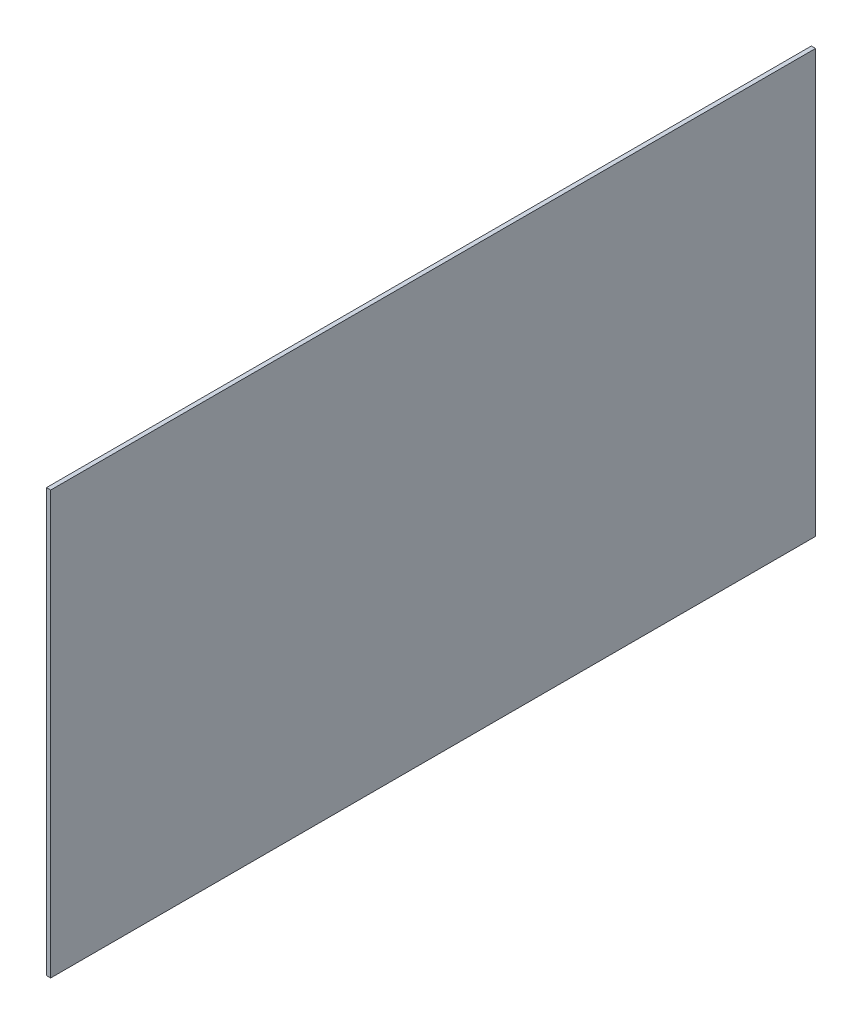
ISO-10303-21;
HEADER;
FILE_DESCRIPTION(('STEP AP214'),'2;1');
FILE_NAME('part.step','',(''),(''),'','','');
FILE_SCHEMA(('AUTOMOTIVE_DESIGN { 1 0 10303 214 1 1 1 1 }'));
ENDSEC;
DATA;
#1=APPLICATION_CONTEXT('core data for automotive mechanical design processes');
#2=APPLICATION_PROTOCOL_DEFINITION('international standard','automotive_design',2000,#1);
#3=PRODUCT_CONTEXT('',#1,'mechanical');
#4=PRODUCT('Part','Part','',(#3));
#5=PRODUCT_RELATED_PRODUCT_CATEGORY('part','',(#4));
#6=PRODUCT_DEFINITION_FORMATION('','',#4);
#7=PRODUCT_DEFINITION_CONTEXT('part definition',#1,'design');
#8=PRODUCT_DEFINITION('design','',#6,#7);
#9=PRODUCT_DEFINITION_SHAPE('','',#8);
#10=(LENGTH_UNIT() NAMED_UNIT(*) SI_UNIT(.MILLI.,.METRE.));
#11=(NAMED_UNIT(*) PLANE_ANGLE_UNIT() SI_UNIT($,.RADIAN.));
#12=(NAMED_UNIT(*) SI_UNIT($,.STERADIAN.) SOLID_ANGLE_UNIT());
#13=UNCERTAINTY_MEASURE_WITH_UNIT(LENGTH_MEASURE(1.E-05),#10,'distance_accuracy_value','');
#14=(GEOMETRIC_REPRESENTATION_CONTEXT(3) GLOBAL_UNCERTAINTY_ASSIGNED_CONTEXT((#13)) GLOBAL_UNIT_ASSIGNED_CONTEXT((#10,
#11,#12)) REPRESENTATION_CONTEXT('',''));
#15=CARTESIAN_POINT('',(0.,0.,0.));
#16=DIRECTION('',(0.,0.,1.));
#17=DIRECTION('',(1.,0.,0.));
#18=AXIS2_PLACEMENT_3D('',#15,#16,#17);
#19=CARTESIAN_POINT('',(1.49999999999997,300.,-271.5));
#20=DIRECTION('',(-1.,0.,0.));
#21=DIRECTION('',(0.,0.,1.));
#22=AXIS2_PLACEMENT_3D('',#19,#20,#21);
#23=PLANE('',#22);
#24=DIRECTION('',(0.,0.,-1.));
#25=VECTOR('',#24,1.);
#26=CARTESIAN_POINT('',(1.49999999999997,0.,-271.5));
#27=LINE('',#26,#25);
#28=CARTESIAN_POINT('',(1.50000000000003,0.,271.5));
#29=VERTEX_POINT('',#28);
#30=CARTESIAN_POINT('',(1.49999999999997,0.,-271.5));
#31=VERTEX_POINT('',#30);
#32=EDGE_CURVE('E115',#29,#31,#27,.T.);
#33=ORIENTED_EDGE('',*,*,#32,.T.);
#34=DIRECTION('',(0.,-1.,0.));
#35=VECTOR('',#34,1.);
#36=CARTESIAN_POINT('',(1.49999999999997,300.,-271.5));
#37=LINE('',#36,#35);
#38=CARTESIAN_POINT('',(1.49999999999997,300.,-271.5));
#39=VERTEX_POINT('',#38);
#40=EDGE_CURVE('E11',#39,#31,#37,.T.);
#41=ORIENTED_EDGE('',*,*,#40,.F.);
#42=DIRECTION('',(0.,0.,-1.));
#43=VECTOR('',#42,1.);
#44=CARTESIAN_POINT('',(1.49999999999997,300.,-271.5));
#45=LINE('',#44,#43);
#46=CARTESIAN_POINT('',(1.50000000000003,300.,271.5));
#47=VERTEX_POINT('',#46);
#48=EDGE_CURVE('E99',#47,#39,#45,.T.);
#49=ORIENTED_EDGE('',*,*,#48,.F.);
#50=DIRECTION('',(0.,-1.,0.));
#51=VECTOR('',#50,1.);
#52=CARTESIAN_POINT('',(1.50000000000003,300.,271.5));
#53=LINE('',#52,#51);
#54=EDGE_CURVE('E111',#47,#29,#53,.T.);
#55=ORIENTED_EDGE('',*,*,#54,.T.);
#56=EDGE_LOOP('',(#33,#41,#49,#55));
#57=FACE_BOUND('',#56,.T.);
#58=ADVANCED_FACE('F47',(#57),#23,.F.);
#59=CARTESIAN_POINT('',(-1.50000000000003,300.,-271.5));
#60=DIRECTION('',(0.,0.,1.));
#61=DIRECTION('',(1.,0.,0.));
#62=AXIS2_PLACEMENT_3D('',#59,#60,#61);
#63=PLANE('',#62);
#64=DIRECTION('',(-1.,0.,0.));
#65=VECTOR('',#64,1.);
#66=CARTESIAN_POINT('',(-1.50000000000003,0.,-271.5));
#67=LINE('',#66,#65);
#68=CARTESIAN_POINT('',(-1.50000000000003,0.,-271.5));
#69=VERTEX_POINT('',#68);
#70=EDGE_CURVE('E104',#31,#69,#67,.T.);
#71=ORIENTED_EDGE('',*,*,#70,.T.);
#72=DIRECTION('',(0.,-1.,0.));
#73=VECTOR('',#72,1.);
#74=CARTESIAN_POINT('',(-1.50000000000003,300.,-271.5));
#75=LINE('',#74,#73);
#76=CARTESIAN_POINT('',(-1.50000000000003,300.,-271.5));
#77=VERTEX_POINT('',#76);
#78=EDGE_CURVE('E56',#77,#69,#75,.T.);
#79=ORIENTED_EDGE('',*,*,#78,.F.);
#80=DIRECTION('',(-1.,0.,0.));
#81=VECTOR('',#80,1.);
#82=CARTESIAN_POINT('',(-1.50000000000003,300.,-271.5));
#83=LINE('',#82,#81);
#84=EDGE_CURVE('E94',#39,#77,#83,.T.);
#85=ORIENTED_EDGE('',*,*,#84,.F.);
#86=ORIENTED_EDGE('',*,*,#40,.T.);
#87=EDGE_LOOP('',(#71,#79,#85,#86));
#88=FACE_BOUND('',#87,.T.);
#89=ADVANCED_FACE('F103',(#88),#63,.F.);
#90=CARTESIAN_POINT('',(-1.50000000000003,300.,-271.5));
#91=DIRECTION('',(1.,0.,0.));
#92=DIRECTION('',(0.,0.,-1.));
#93=AXIS2_PLACEMENT_3D('',#90,#91,#92);
#94=PLANE('',#93);
#95=DIRECTION('',(0.,0.,1.));
#96=VECTOR('',#95,1.);
#97=CARTESIAN_POINT('',(-1.50000000000003,0.,-271.5));
#98=LINE('',#97,#96);
#99=CARTESIAN_POINT('',(-1.49999999999997,0.,271.5));
#100=VERTEX_POINT('',#99);
#101=EDGE_CURVE('E81',#69,#100,#98,.T.);
#102=ORIENTED_EDGE('',*,*,#101,.T.);
#103=DIRECTION('',(0.,-1.,0.));
#104=VECTOR('',#103,1.);
#105=CARTESIAN_POINT('',(-1.49999999999997,300.,271.5));
#106=LINE('',#105,#104);
#107=CARTESIAN_POINT('',(-1.49999999999997,300.,271.5));
#108=VERTEX_POINT('',#107);
#109=EDGE_CURVE('E106',#108,#100,#106,.T.);
#110=ORIENTED_EDGE('',*,*,#109,.F.);
#111=DIRECTION('',(0.,0.,1.));
#112=VECTOR('',#111,1.);
#113=CARTESIAN_POINT('',(-1.50000000000003,300.,-271.5));
#114=LINE('',#113,#112);
#115=EDGE_CURVE('E97',#77,#108,#114,.T.);
#116=ORIENTED_EDGE('',*,*,#115,.F.);
#117=ORIENTED_EDGE('',*,*,#78,.T.);
#118=EDGE_LOOP('',(#102,#110,#116,#117));
#119=FACE_BOUND('',#118,.T.);
#120=ADVANCED_FACE('F107',(#119),#94,.F.);
#121=CARTESIAN_POINT('',(-1.49999999999997,300.,271.5));
#122=DIRECTION('',(0.,0.,-1.));
#123=DIRECTION('',(-1.,0.,0.));
#124=AXIS2_PLACEMENT_3D('',#121,#122,#123);
#125=PLANE('',#124);
#126=DIRECTION('',(1.,0.,0.));
#127=VECTOR('',#126,1.);
#128=CARTESIAN_POINT('',(-1.49999999999997,0.,271.5));
#129=LINE('',#128,#127);
#130=EDGE_CURVE('E87',#100,#29,#129,.T.);
#131=ORIENTED_EDGE('',*,*,#130,.T.);
#132=ORIENTED_EDGE('',*,*,#54,.F.);
#133=DIRECTION('',(1.,0.,0.));
#134=VECTOR('',#133,1.);
#135=CARTESIAN_POINT('',(-1.49999999999997,300.,271.5));
#136=LINE('',#135,#134);
#137=EDGE_CURVE('E64',#108,#47,#136,.T.);
#138=ORIENTED_EDGE('',*,*,#137,.F.);
#139=ORIENTED_EDGE('',*,*,#109,.T.);
#140=EDGE_LOOP('',(#131,#132,#138,#139));
#141=FACE_BOUND('',#140,.T.);
#142=ADVANCED_FACE('F128',(#141),#125,.F.);
#143=CARTESIAN_POINT('',(0.,300.,0.));
#144=DIRECTION('',(0.,1.,0.));
#145=DIRECTION('',(0.,0.,1.));
#146=AXIS2_PLACEMENT_3D('',#143,#144,#145);
#147=PLANE('',#146);
#148=ORIENTED_EDGE('',*,*,#48,.T.);
#149=ORIENTED_EDGE('',*,*,#84,.T.);
#150=ORIENTED_EDGE('',*,*,#115,.T.);
#151=ORIENTED_EDGE('',*,*,#137,.T.);
#152=EDGE_LOOP('',(#148,#149,#150,#151));
#153=FACE_BOUND('',#152,.T.);
#154=ADVANCED_FACE('F95',(#153),#147,.T.);
#155=CARTESIAN_POINT('',(0.,0.,0.));
#156=DIRECTION('',(0.,1.,0.));
#157=DIRECTION('',(0.,0.,1.));
#158=AXIS2_PLACEMENT_3D('',#155,#156,#157);
#159=PLANE('',#158);
#160=ORIENTED_EDGE('',*,*,#32,.F.);
#161=ORIENTED_EDGE('',*,*,#130,.F.);
#162=ORIENTED_EDGE('',*,*,#101,.F.);
#163=ORIENTED_EDGE('',*,*,#70,.F.);
#164=EDGE_LOOP('',(#160,#161,#162,#163));
#165=FACE_BOUND('',#164,.T.);
#166=ADVANCED_FACE('F131',(#165),#159,.F.);
#167=CLOSED_SHELL('',(#58,#89,#120,#142,#154,#166));
#168=MANIFOLD_SOLID_BREP('B2',#167);
#169=ADVANCED_BREP_SHAPE_REPRESENTATION('',(#18,#168),#14);
#170=SHAPE_DEFINITION_REPRESENTATION(#9,#169);
ENDSEC;
END-ISO-10303-21;
